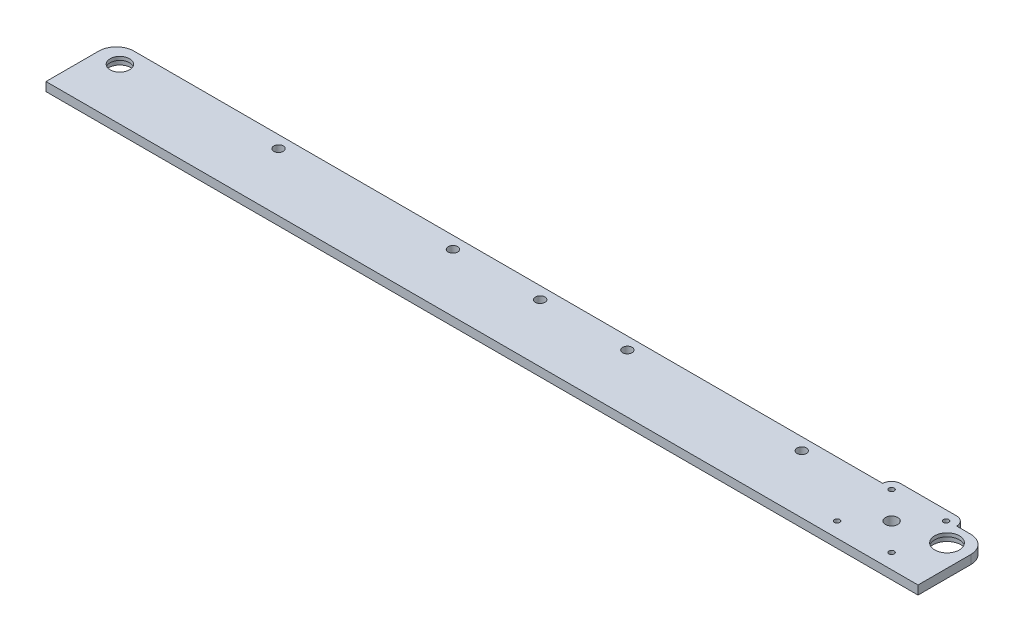
ISO-10303-21;
HEADER;
FILE_DESCRIPTION(('STEP AP214'),'2;1');
FILE_NAME('part.step','',(''),(''),'','','');
FILE_SCHEMA(('AUTOMOTIVE_DESIGN { 1 0 10303 214 1 1 1 1 }'));
ENDSEC;
DATA;
#1=APPLICATION_CONTEXT('core data for automotive mechanical design processes');
#2=APPLICATION_PROTOCOL_DEFINITION('international standard','automotive_design',2000,#1);
#3=PRODUCT_CONTEXT('',#1,'mechanical');
#4=PRODUCT('Part','Part','',(#3));
#5=PRODUCT_RELATED_PRODUCT_CATEGORY('part','',(#4));
#6=PRODUCT_DEFINITION_FORMATION('','',#4);
#7=PRODUCT_DEFINITION_CONTEXT('part definition',#1,'design');
#8=PRODUCT_DEFINITION('design','',#6,#7);
#9=PRODUCT_DEFINITION_SHAPE('','',#8);
#10=(LENGTH_UNIT() NAMED_UNIT(*) SI_UNIT(.MILLI.,.METRE.));
#11=(NAMED_UNIT(*) PLANE_ANGLE_UNIT() SI_UNIT($,.RADIAN.));
#12=(NAMED_UNIT(*) SI_UNIT($,.STERADIAN.) SOLID_ANGLE_UNIT());
#13=UNCERTAINTY_MEASURE_WITH_UNIT(LENGTH_MEASURE(1.E-05),#10,'distance_accuracy_value','');
#14=(GEOMETRIC_REPRESENTATION_CONTEXT(3) GLOBAL_UNCERTAINTY_ASSIGNED_CONTEXT((#13)) GLOBAL_UNIT_ASSIGNED_CONTEXT((#10,
#11,#12)) REPRESENTATION_CONTEXT('',''));
#15=CARTESIAN_POINT('',(0.,0.,0.));
#16=DIRECTION('',(0.,0.,1.));
#17=DIRECTION('',(1.,0.,0.));
#18=AXIS2_PLACEMENT_3D('',#15,#16,#17);
#19=CARTESIAN_POINT('',(49.1679753727923,0.,-63.278006446656));
#20=DIRECTION('',(0.,1.,0.));
#21=DIRECTION('',(0.,0.,1.));
#22=AXIS2_PLACEMENT_3D('',#19,#20,#21);
#23=CYLINDRICAL_SURFACE('',#22,1.5);
#24=CARTESIAN_POINT('',(49.1679753727923,5.,-63.278006446656));
#25=DIRECTION('',(0.,1.,0.));
#26=DIRECTION('',(0.,0.,1.));
#27=AXIS2_PLACEMENT_3D('',#24,#25,#26);
#28=CIRCLE('',#27,1.5);
#29=CARTESIAN_POINT('',(49.1679753727923,5.,-61.778006446656));
#30=VERTEX_POINT('',#29);
#31=EDGE_CURVE('E227',#30,#30,#28,.T.);
#32=ORIENTED_EDGE('',*,*,#31,.T.);
#33=EDGE_LOOP('',(#32));
#34=FACE_BOUND('',#33,.T.);
#35=CARTESIAN_POINT('',(49.1679753727923,2.,-63.278006446656));
#36=DIRECTION('',(0.,-1.,0.));
#37=DIRECTION('',(0.,0.,-1.));
#38=AXIS2_PLACEMENT_3D('',#35,#36,#37);
#39=CIRCLE('',#38,1.5);
#40=CARTESIAN_POINT('',(49.1679753727923,2.,-64.778006446656));
#41=VERTEX_POINT('',#40);
#42=EDGE_CURVE('E41',#41,#41,#39,.F.);
#43=ORIENTED_EDGE('',*,*,#42,.F.);
#44=EDGE_LOOP('',(#43));
#45=FACE_BOUND('',#44,.T.);
#46=ADVANCED_FACE('F37',(#34,#45),#23,.F.);
#47=CARTESIAN_POINT('',(80.1679753727923,0.,-63.278006446656));
#48=DIRECTION('',(0.,1.,0.));
#49=DIRECTION('',(0.,0.,1.));
#50=AXIS2_PLACEMENT_3D('',#47,#48,#49);
#51=CYLINDRICAL_SURFACE('',#50,1.5);
#52=CARTESIAN_POINT('',(80.1679753727923,5.,-63.278006446656));
#53=DIRECTION('',(0.,1.,0.));
#54=DIRECTION('',(0.,0.,1.));
#55=AXIS2_PLACEMENT_3D('',#52,#53,#54);
#56=CIRCLE('',#55,1.5);
#57=CARTESIAN_POINT('',(80.1679753727923,5.,-61.778006446656));
#58=VERTEX_POINT('',#57);
#59=EDGE_CURVE('E216',#58,#58,#56,.T.);
#60=ORIENTED_EDGE('',*,*,#59,.T.);
#61=EDGE_LOOP('',(#60));
#62=FACE_BOUND('',#61,.T.);
#63=CARTESIAN_POINT('',(80.1679753727923,2.,-63.278006446656));
#64=DIRECTION('',(0.,-1.,0.));
#65=DIRECTION('',(0.,0.,-1.));
#66=AXIS2_PLACEMENT_3D('',#63,#64,#65);
#67=CIRCLE('',#66,1.5);
#68=CARTESIAN_POINT('',(80.1679753727923,2.,-64.778006446656));
#69=VERTEX_POINT('',#68);
#70=EDGE_CURVE('E202',#69,#69,#67,.F.);
#71=ORIENTED_EDGE('',*,*,#70,.F.);
#72=EDGE_LOOP('',(#71));
#73=FACE_BOUND('',#72,.T.);
#74=ADVANCED_FACE('F319',(#62,#73),#51,.F.);
#75=CARTESIAN_POINT('',(80.1679753727923,0.,-32.278006446656));
#76=DIRECTION('',(0.,1.,0.));
#77=DIRECTION('',(0.,0.,1.));
#78=AXIS2_PLACEMENT_3D('',#75,#76,#77);
#79=CYLINDRICAL_SURFACE('',#78,1.5);
#80=CARTESIAN_POINT('',(80.1679753727923,5.,-32.278006446656));
#81=DIRECTION('',(0.,1.,0.));
#82=DIRECTION('',(0.,0.,1.));
#83=AXIS2_PLACEMENT_3D('',#80,#81,#82);
#84=CIRCLE('',#83,1.5);
#85=CARTESIAN_POINT('',(80.1679753727923,5.,-30.778006446656));
#86=VERTEX_POINT('',#85);
#87=EDGE_CURVE('E211',#86,#86,#84,.T.);
#88=ORIENTED_EDGE('',*,*,#87,.T.);
#89=EDGE_LOOP('',(#88));
#90=FACE_BOUND('',#89,.T.);
#91=CARTESIAN_POINT('',(80.1679753727923,2.,-32.278006446656));
#92=DIRECTION('',(0.,-1.,0.));
#93=DIRECTION('',(0.,0.,-1.));
#94=AXIS2_PLACEMENT_3D('',#91,#92,#93);
#95=CIRCLE('',#94,1.5);
#96=CARTESIAN_POINT('',(80.1679753727923,2.,-33.778006446656));
#97=VERTEX_POINT('',#96);
#98=EDGE_CURVE('E199',#97,#97,#95,.F.);
#99=ORIENTED_EDGE('',*,*,#98,.F.);
#100=EDGE_LOOP('',(#99));
#101=FACE_BOUND('',#100,.T.);
#102=ADVANCED_FACE('F325',(#90,#101),#79,.F.);
#103=CARTESIAN_POINT('',(49.1679753727923,0.,-32.278006446656));
#104=DIRECTION('',(0.,1.,0.));
#105=DIRECTION('',(0.,0.,1.));
#106=AXIS2_PLACEMENT_3D('',#103,#104,#105);
#107=CYLINDRICAL_SURFACE('',#106,1.5);
#108=CARTESIAN_POINT('',(49.1679753727923,5.,-32.278006446656));
#109=DIRECTION('',(0.,1.,0.));
#110=DIRECTION('',(0.,0.,1.));
#111=AXIS2_PLACEMENT_3D('',#108,#109,#110);
#112=CIRCLE('',#111,1.5);
#113=CARTESIAN_POINT('',(49.1679753727923,5.,-30.778006446656));
#114=VERTEX_POINT('',#113);
#115=EDGE_CURVE('E207',#114,#114,#112,.T.);
#116=ORIENTED_EDGE('',*,*,#115,.T.);
#117=EDGE_LOOP('',(#116));
#118=FACE_BOUND('',#117,.T.);
#119=CARTESIAN_POINT('',(49.1679753727923,2.,-32.278006446656));
#120=DIRECTION('',(0.,-1.,0.));
#121=DIRECTION('',(0.,0.,-1.));
#122=AXIS2_PLACEMENT_3D('',#119,#120,#121);
#123=CIRCLE('',#122,1.5);
#124=CARTESIAN_POINT('',(49.1679753727923,2.,-33.778006446656));
#125=VERTEX_POINT('',#124);
#126=EDGE_CURVE('E196',#125,#125,#123,.F.);
#127=ORIENTED_EDGE('',*,*,#126,.F.);
#128=EDGE_LOOP('',(#127));
#129=FACE_BOUND('',#128,.T.);
#130=ADVANCED_FACE('F336',(#118,#129),#107,.F.);
#131=CARTESIAN_POINT('',(-392.299026304365,5.,-63.778006446656));
#132=DIRECTION('',(0.,0.,1.));
#133=DIRECTION('',(1.,0.,0.));
#134=AXIS2_PLACEMENT_3D('',#131,#132,#133);
#135=PLANE('',#134);
#136=DIRECTION('',(-1.,0.,0.));
#137=VECTOR('',#136,1.);
#138=CARTESIAN_POINT('',(-392.299026304365,5.,-63.778006446656));
#139=LINE('',#138,#137);
#140=CARTESIAN_POINT('',(43.6679753727923,5.,-63.778006446656));
#141=VERTEX_POINT('',#140);
#142=CARTESIAN_POINT('',(-382.299026304365,5.,-63.778006446656));
#143=VERTEX_POINT('',#142);
#144=EDGE_CURVE('E143',#141,#143,#139,.T.);
#145=ORIENTED_EDGE('',*,*,#144,.F.);
#146=DIRECTION('',(0.,-1.,0.));
#147=VECTOR('',#146,1.);
#148=CARTESIAN_POINT('',(43.6679753727923,5.,-63.778006446656));
#149=LINE('',#148,#147);
#150=CARTESIAN_POINT('',(43.6679753727923,0.,-63.778006446656));
#151=VERTEX_POINT('',#150);
#152=EDGE_CURVE('E134',#141,#151,#149,.T.);
#153=ORIENTED_EDGE('',*,*,#152,.T.);
#154=DIRECTION('',(-1.,0.,0.));
#155=VECTOR('',#154,1.);
#156=CARTESIAN_POINT('',(-392.299026304365,0.,-63.778006446656));
#157=LINE('',#156,#155);
#158=CARTESIAN_POINT('',(-382.299026304365,0.,-63.778006446656));
#159=VERTEX_POINT('',#158);
#160=EDGE_CURVE('E160',#151,#159,#157,.T.);
#161=ORIENTED_EDGE('',*,*,#160,.T.);
#162=DIRECTION('',(0.,-1.,0.));
#163=VECTOR('',#162,1.);
#164=CARTESIAN_POINT('',(-382.299026304365,5.,-63.778006446656));
#165=LINE('',#164,#163);
#166=EDGE_CURVE('E183',#159,#143,#165,.F.);
#167=ORIENTED_EDGE('',*,*,#166,.T.);
#168=EDGE_LOOP('',(#145,#153,#161,#167));
#169=FACE_BOUND('',#168,.T.);
#170=ADVANCED_FACE('F294',(#169),#135,.F.);
#171=CARTESIAN_POINT('',(-379.799026304365,5.,-53.278006446656));
#172=DIRECTION('',(0.,-1.,0.));
#173=DIRECTION('',(0.,0.,-1.));
#174=AXIS2_PLACEMENT_3D('',#171,#172,#173);
#175=CYLINDRICAL_SURFACE('',#174,5.50000000000002);
#176=CARTESIAN_POINT('',(-379.799026304365,5.,-53.278006446656));
#177=DIRECTION('',(0.,1.,0.));
#178=DIRECTION('',(0.,0.,1.));
#179=AXIS2_PLACEMENT_3D('',#176,#177,#178);
#180=CIRCLE('',#179,5.50000000000002);
#181=CARTESIAN_POINT('',(-379.799026304365,5.,-47.778006446656));
#182=VERTEX_POINT('',#181);
#183=EDGE_CURVE('E268',#182,#182,#180,.T.);
#184=ORIENTED_EDGE('',*,*,#183,.T.);
#185=EDGE_LOOP('',(#184));
#186=FACE_BOUND('',#185,.T.);
#187=CARTESIAN_POINT('',(-379.799026304365,3.,-53.278006446656));
#188=DIRECTION('',(0.,-1.,0.));
#189=DIRECTION('',(0.,0.,-1.));
#190=AXIS2_PLACEMENT_3D('',#187,#188,#189);
#191=CIRCLE('',#190,5.50000000000002);
#192=CARTESIAN_POINT('',(-379.799026304365,3.,-58.778006446656));
#193=VERTEX_POINT('',#192);
#194=EDGE_CURVE('E169',#193,#193,#191,.T.);
#195=ORIENTED_EDGE('',*,*,#194,.T.);
#196=EDGE_LOOP('',(#195));
#197=FACE_BOUND('',#196,.T.);
#198=ADVANCED_FACE('F381',(#186,#197),#175,.F.);
#199=CARTESIAN_POINT('',(91.2009736956355,5.,-52.778006446656));
#200=DIRECTION('',(0.,-1.,0.));
#201=DIRECTION('',(0.,0.,-1.));
#202=AXIS2_PLACEMENT_3D('',#199,#200,#201);
#203=CYLINDRICAL_SURFACE('',#202,7.);
#204=CARTESIAN_POINT('',(91.2009736956355,5.,-52.778006446656));
#205=DIRECTION('',(0.,1.,0.));
#206=DIRECTION('',(0.,0.,1.));
#207=AXIS2_PLACEMENT_3D('',#204,#205,#206);
#208=CIRCLE('',#207,7.);
#209=CARTESIAN_POINT('',(91.2009736956355,5.,-45.778006446656));
#210=VERTEX_POINT('',#209);
#211=EDGE_CURVE('E263',#210,#210,#208,.T.);
#212=ORIENTED_EDGE('',*,*,#211,.T.);
#213=EDGE_LOOP('',(#212));
#214=FACE_BOUND('',#213,.T.);
#215=CARTESIAN_POINT('',(91.2009736956355,3.,-52.778006446656));
#216=DIRECTION('',(0.,-1.,0.));
#217=DIRECTION('',(0.,0.,-1.));
#218=AXIS2_PLACEMENT_3D('',#215,#216,#217);
#219=CIRCLE('',#218,7.);
#220=CARTESIAN_POINT('',(91.2009736956355,3.,-59.778006446656));
#221=VERTEX_POINT('',#220);
#222=EDGE_CURVE('E166',#221,#221,#219,.T.);
#223=ORIENTED_EDGE('',*,*,#222,.T.);
#224=EDGE_LOOP('',(#223));
#225=FACE_BOUND('',#224,.T.);
#226=ADVANCED_FACE('F378',(#214,#225),#203,.F.);
#227=CARTESIAN_POINT('',(0.,5.,0.));
#228=DIRECTION('',(0.,1.,0.));
#229=DIRECTION('',(0.,0.,1.));
#230=AXIS2_PLACEMENT_3D('',#227,#228,#229);
#231=PLANE('',#230);
#232=ORIENTED_EDGE('',*,*,#115,.F.);
#233=EDGE_LOOP('',(#232));
#234=FACE_BOUND('',#233,.T.);
#235=ORIENTED_EDGE('',*,*,#87,.F.);
#236=EDGE_LOOP('',(#235));
#237=FACE_BOUND('',#236,.T.);
#238=ORIENTED_EDGE('',*,*,#59,.F.);
#239=EDGE_LOOP('',(#238));
#240=FACE_BOUND('',#239,.T.);
#241=ORIENTED_EDGE('',*,*,#31,.F.);
#242=EDGE_LOOP('',(#241));
#243=FACE_BOUND('',#242,.T.);
#244=CARTESIAN_POINT('',(64.6679753727923,5.,-47.778006446656));
#245=DIRECTION('',(0.,1.,0.));
#246=DIRECTION('',(0.,0.,1.));
#247=AXIS2_PLACEMENT_3D('',#244,#245,#246);
#248=CIRCLE('',#247,3.50000000000001);
#249=CARTESIAN_POINT('',(64.6679753727923,5.,-44.278006446656));
#250=VERTEX_POINT('',#249);
#251=EDGE_CURVE('E224',#250,#250,#248,.T.);
#252=ORIENTED_EDGE('',*,*,#251,.F.);
#253=EDGE_LOOP('',(#252));
#254=FACE_BOUND('',#253,.T.);
#255=DIRECTION('',(-1.,0.,0.));
#256=VECTOR('',#255,1.);
#257=CARTESIAN_POINT('',(43.6679753727923,5.,-68.778006446656));
#258=LINE('',#257,#256);
#259=CARTESIAN_POINT('',(80.6679753727923,5.,-68.778006446656));
#260=VERTEX_POINT('',#259);
#261=CARTESIAN_POINT('',(48.6679753727923,5.,-68.778006446656));
#262=VERTEX_POINT('',#261);
#263=EDGE_CURVE('E223',#260,#262,#258,.T.);
#264=ORIENTED_EDGE('',*,*,#263,.T.);
#265=CARTESIAN_POINT('',(48.6679753727923,5.,-63.778006446656));
#266=DIRECTION('',(0.,1.,0.));
#267=DIRECTION('',(0.,0.,1.));
#268=AXIS2_PLACEMENT_3D('',#265,#266,#267);
#269=CIRCLE('',#268,5.);
#270=EDGE_CURVE('E122',#262,#141,#269,.T.);
#271=ORIENTED_EDGE('',*,*,#270,.T.);
#272=ORIENTED_EDGE('',*,*,#144,.T.);
#273=CARTESIAN_POINT('',(-382.299026304365,5.,-53.778006446656));
#274=DIRECTION('',(0.,1.,0.));
#275=DIRECTION('',(0.,0.,1.));
#276=AXIS2_PLACEMENT_3D('',#273,#274,#275);
#277=CIRCLE('',#276,10.);
#278=CARTESIAN_POINT('',(-392.299026304365,5.,-53.778006446656));
#279=VERTEX_POINT('',#278);
#280=EDGE_CURVE('E187',#143,#279,#277,.T.);
#281=ORIENTED_EDGE('',*,*,#280,.T.);
#282=DIRECTION('',(0.,0.,1.));
#283=VECTOR('',#282,1.);
#284=CARTESIAN_POINT('',(-392.299026304365,5.,-63.778006446656));
#285=LINE('',#284,#283);
#286=CARTESIAN_POINT('',(-392.299026304365,5.,-23.778006446656));
#287=VERTEX_POINT('',#286);
#288=EDGE_CURVE('E161',#279,#287,#285,.T.);
#289=ORIENTED_EDGE('',*,*,#288,.T.);
#290=DIRECTION('',(1.,0.,0.));
#291=VECTOR('',#290,1.);
#292=CARTESIAN_POINT('',(-392.299026304365,5.,-23.778006446656));
#293=LINE('',#292,#291);
#294=CARTESIAN_POINT('',(103.700973695635,5.,-23.778006446656));
#295=VERTEX_POINT('',#294);
#296=EDGE_CURVE('E276',#287,#295,#293,.T.);
#297=ORIENTED_EDGE('',*,*,#296,.T.);
#298=DIRECTION('',(0.,0.,-1.));
#299=VECTOR('',#298,1.);
#300=CARTESIAN_POINT('',(103.700973695635,5.,-63.778006446656));
#301=LINE('',#300,#299);
#302=CARTESIAN_POINT('',(103.700973695635,5.,-53.778006446656));
#303=VERTEX_POINT('',#302);
#304=EDGE_CURVE('E148',#295,#303,#301,.T.);
#305=ORIENTED_EDGE('',*,*,#304,.T.);
#306=CARTESIAN_POINT('',(93.7009736956355,5.,-53.778006446656));
#307=DIRECTION('',(0.,1.,0.));
#308=DIRECTION('',(0.,0.,1.));
#309=AXIS2_PLACEMENT_3D('',#306,#307,#308);
#310=CIRCLE('',#309,10.);
#311=CARTESIAN_POINT('',(93.7009736956355,5.,-63.778006446656));
#312=VERTEX_POINT('',#311);
#313=EDGE_CURVE('E141',#303,#312,#310,.T.);
#314=ORIENTED_EDGE('',*,*,#313,.T.);
#315=CARTESIAN_POINT('',(85.6679753727923,5.,-63.778006446656));
#316=VERTEX_POINT('',#315);
#317=EDGE_CURVE('E130',#312,#316,#139,.T.);
#318=ORIENTED_EDGE('',*,*,#317,.T.);
#319=CARTESIAN_POINT('',(80.6679753727923,5.,-63.778006446656));
#320=DIRECTION('',(0.,1.,0.));
#321=DIRECTION('',(0.,0.,1.));
#322=AXIS2_PLACEMENT_3D('',#319,#320,#321);
#323=CIRCLE('',#322,5.);
#324=EDGE_CURVE('E115',#316,#260,#323,.T.);
#325=ORIENTED_EDGE('',*,*,#324,.T.);
#326=EDGE_LOOP('',(#264,#271,#272,#281,#289,#297,#305,#314,#318,#325));
#327=FACE_BOUND('',#326,.T.);
#328=CARTESIAN_POINT('',(-144.299026304365,5.,-56.8446731133226));
#329=DIRECTION('',(0.,1.,0.));
#330=DIRECTION('',(0.,0.,1.));
#331=AXIS2_PLACEMENT_3D('',#328,#329,#330);
#332=CIRCLE('',#331,2.70000000000001);
#333=CARTESIAN_POINT('',(-144.299026304365,5.,-54.1446731133226));
#334=VERTEX_POINT('',#333);
#335=EDGE_CURVE('E248',#334,#334,#332,.T.);
#336=ORIENTED_EDGE('',*,*,#335,.F.);
#337=EDGE_LOOP('',(#336));
#338=FACE_BOUND('',#337,.T.);
#339=CARTESIAN_POINT('',(-94.6990263043645,5.,-56.8446731133226));
#340=DIRECTION('',(0.,1.,0.));
#341=DIRECTION('',(0.,0.,1.));
#342=AXIS2_PLACEMENT_3D('',#339,#340,#341);
#343=CIRCLE('',#342,2.7);
#344=CARTESIAN_POINT('',(-94.6990263043645,5.,-54.1446731133226));
#345=VERTEX_POINT('',#344);
#346=EDGE_CURVE('E260',#345,#345,#343,.T.);
#347=ORIENTED_EDGE('',*,*,#346,.F.);
#348=EDGE_LOOP('',(#347));
#349=FACE_BOUND('',#348,.T.);
#350=ORIENTED_EDGE('',*,*,#183,.F.);
#351=EDGE_LOOP('',(#350));
#352=FACE_BOUND('',#351,.T.);
#353=CARTESIAN_POINT('',(-193.899026304365,5.,-56.8446731133226));
#354=DIRECTION('',(0.,1.,0.));
#355=DIRECTION('',(0.,0.,1.));
#356=AXIS2_PLACEMENT_3D('',#353,#354,#355);
#357=CIRCLE('',#356,2.70000000000001);
#358=CARTESIAN_POINT('',(-193.899026304365,5.,-54.1446731133226));
#359=VERTEX_POINT('',#358);
#360=EDGE_CURVE('E155',#359,#359,#357,.T.);
#361=ORIENTED_EDGE('',*,*,#360,.F.);
#362=EDGE_LOOP('',(#361));
#363=FACE_BOUND('',#362,.T.);
#364=ORIENTED_EDGE('',*,*,#211,.F.);
#365=EDGE_LOOP('',(#364));
#366=FACE_BOUND('',#365,.T.);
#367=CARTESIAN_POINT('',(4.50097369563546,5.,-56.8446731133226));
#368=DIRECTION('',(0.,1.,0.));
#369=DIRECTION('',(0.,0.,1.));
#370=AXIS2_PLACEMENT_3D('',#367,#368,#369);
#371=CIRCLE('',#370,2.7);
#372=CARTESIAN_POINT('',(4.50097369563546,5.,-54.1446731133226));
#373=VERTEX_POINT('',#372);
#374=EDGE_CURVE('E254',#373,#373,#371,.T.);
#375=ORIENTED_EDGE('',*,*,#374,.F.);
#376=EDGE_LOOP('',(#375));
#377=FACE_BOUND('',#376,.T.);
#378=CARTESIAN_POINT('',(-293.099026304365,5.,-56.8446731133226));
#379=DIRECTION('',(0.,1.,0.));
#380=DIRECTION('',(0.,0.,1.));
#381=AXIS2_PLACEMENT_3D('',#378,#379,#380);
#382=CIRCLE('',#381,2.69999999999996);
#383=CARTESIAN_POINT('',(-293.099026304365,5.,-54.1446731133227));
#384=VERTEX_POINT('',#383);
#385=EDGE_CURVE('E242',#384,#384,#382,.T.);
#386=ORIENTED_EDGE('',*,*,#385,.F.);
#387=EDGE_LOOP('',(#386));
#388=FACE_BOUND('',#387,.T.);
#389=ADVANCED_FACE('F137',(#234,#237,#240,#243,#254,#327,#338,#349,#352,#363,#366,#377,#388),
#231,.T.);
#390=CARTESIAN_POINT('',(0.,0.,0.));
#391=DIRECTION('',(0.,1.,0.));
#392=DIRECTION('',(0.,0.,1.));
#393=AXIS2_PLACEMENT_3D('',#390,#391,#392);
#394=PLANE('',#393);
#395=CARTESIAN_POINT('',(80.1679753727923,0.,-32.278006446656));
#396=DIRECTION('',(0.,-1.,0.));
#397=DIRECTION('',(0.,0.,-1.));
#398=AXIS2_PLACEMENT_3D('',#395,#396,#397);
#399=CIRCLE('',#398,3.00000000000001);
#400=CARTESIAN_POINT('',(80.1679753727923,0.,-35.278006446656));
#401=VERTEX_POINT('',#400);
#402=EDGE_CURVE('E401',#401,#401,#399,.T.);
#403=ORIENTED_EDGE('',*,*,#402,.F.);
#404=EDGE_LOOP('',(#403));
#405=FACE_BOUND('',#404,.T.);
#406=CARTESIAN_POINT('',(49.1679753727923,0.,-63.278006446656));
#407=DIRECTION('',(0.,-1.,0.));
#408=DIRECTION('',(0.,0.,-1.));
#409=AXIS2_PLACEMENT_3D('',#406,#407,#408);
#410=CIRCLE('',#409,3.);
#411=CARTESIAN_POINT('',(49.1679753727923,0.,-66.278006446656));
#412=VERTEX_POINT('',#411);
#413=EDGE_CURVE('E405',#412,#412,#410,.T.);
#414=ORIENTED_EDGE('',*,*,#413,.F.);
#415=EDGE_LOOP('',(#414));
#416=FACE_BOUND('',#415,.T.);
#417=CARTESIAN_POINT('',(80.1679753727923,0.,-63.278006446656));
#418=DIRECTION('',(0.,-1.,0.));
#419=DIRECTION('',(0.,0.,-1.));
#420=AXIS2_PLACEMENT_3D('',#417,#418,#419);
#421=CIRCLE('',#420,3.00000000000001);
#422=CARTESIAN_POINT('',(80.1679753727923,0.,-66.278006446656));
#423=VERTEX_POINT('',#422);
#424=EDGE_CURVE('E409',#423,#423,#421,.T.);
#425=ORIENTED_EDGE('',*,*,#424,.F.);
#426=EDGE_LOOP('',(#425));
#427=FACE_BOUND('',#426,.T.);
#428=CARTESIAN_POINT('',(49.1679753727923,0.,-32.278006446656));
#429=DIRECTION('',(0.,-1.,0.));
#430=DIRECTION('',(0.,0.,-1.));
#431=AXIS2_PLACEMENT_3D('',#428,#429,#430);
#432=CIRCLE('',#431,3.);
#433=CARTESIAN_POINT('',(49.1679753727923,0.,-35.278006446656));
#434=VERTEX_POINT('',#433);
#435=EDGE_CURVE('E413',#434,#434,#432,.T.);
#436=ORIENTED_EDGE('',*,*,#435,.F.);
#437=EDGE_LOOP('',(#436));
#438=FACE_BOUND('',#437,.T.);
#439=CARTESIAN_POINT('',(64.6679753727923,0.,-47.778006446656));
#440=DIRECTION('',(0.,1.,0.));
#441=DIRECTION('',(0.,0.,1.));
#442=AXIS2_PLACEMENT_3D('',#439,#440,#441);
#443=CIRCLE('',#442,3.50000000000001);
#444=CARTESIAN_POINT('',(64.6679753727923,0.,-44.278006446656));
#445=VERTEX_POINT('',#444);
#446=EDGE_CURVE('E220',#445,#445,#443,.T.);
#447=ORIENTED_EDGE('',*,*,#446,.T.);
#448=EDGE_LOOP('',(#447));
#449=FACE_BOUND('',#448,.T.);
#450=ORIENTED_EDGE('',*,*,#160,.F.);
#451=CARTESIAN_POINT('',(48.6679753727923,0.,-63.778006446656));
#452=DIRECTION('',(0.,1.,0.));
#453=DIRECTION('',(0.,0.,1.));
#454=AXIS2_PLACEMENT_3D('',#451,#452,#453);
#455=CIRCLE('',#454,5.);
#456=CARTESIAN_POINT('',(48.6679753727923,0.,-68.778006446656));
#457=VERTEX_POINT('',#456);
#458=EDGE_CURVE('E11',#151,#457,#455,.F.);
#459=ORIENTED_EDGE('',*,*,#458,.T.);
#460=DIRECTION('',(-1.,0.,0.));
#461=VECTOR('',#460,1.);
#462=CARTESIAN_POINT('',(43.6679753727923,0.,-68.778006446656));
#463=LINE('',#462,#461);
#464=CARTESIAN_POINT('',(80.6679753727923,0.,-68.778006446656));
#465=VERTEX_POINT('',#464);
#466=EDGE_CURVE('E228',#465,#457,#463,.T.);
#467=ORIENTED_EDGE('',*,*,#466,.F.);
#468=CARTESIAN_POINT('',(80.6679753727923,0.,-63.778006446656));
#469=DIRECTION('',(0.,1.,0.));
#470=DIRECTION('',(0.,0.,1.));
#471=AXIS2_PLACEMENT_3D('',#468,#469,#470);
#472=CIRCLE('',#471,5.);
#473=CARTESIAN_POINT('',(85.6679753727923,0.,-63.778006446656));
#474=VERTEX_POINT('',#473);
#475=EDGE_CURVE('E46',#465,#474,#472,.F.);
#476=ORIENTED_EDGE('',*,*,#475,.T.);
#477=CARTESIAN_POINT('',(93.7009736956355,0.,-63.778006446656));
#478=VERTEX_POINT('',#477);
#479=EDGE_CURVE('E133',#478,#474,#157,.T.);
#480=ORIENTED_EDGE('',*,*,#479,.F.);
#481=CARTESIAN_POINT('',(93.7009736956355,0.,-53.778006446656));
#482=DIRECTION('',(0.,1.,0.));
#483=DIRECTION('',(0.,0.,1.));
#484=AXIS2_PLACEMENT_3D('',#481,#482,#483);
#485=CIRCLE('',#484,10.);
#486=CARTESIAN_POINT('',(103.700973695635,0.,-53.778006446656));
#487=VERTEX_POINT('',#486);
#488=EDGE_CURVE('E176',#478,#487,#485,.F.);
#489=ORIENTED_EDGE('',*,*,#488,.T.);
#490=DIRECTION('',(0.,0.,-1.));
#491=VECTOR('',#490,1.);
#492=CARTESIAN_POINT('',(103.700973695635,0.,-63.778006446656));
#493=LINE('',#492,#491);
#494=CARTESIAN_POINT('',(103.700973695635,0.,-23.778006446656));
#495=VERTEX_POINT('',#494);
#496=EDGE_CURVE('E157',#495,#487,#493,.T.);
#497=ORIENTED_EDGE('',*,*,#496,.F.);
#498=DIRECTION('',(1.,0.,0.));
#499=VECTOR('',#498,1.);
#500=CARTESIAN_POINT('',(-392.299026304365,0.,-23.778006446656));
#501=LINE('',#500,#499);
#502=CARTESIAN_POINT('',(-392.299026304365,0.,-23.778006446656));
#503=VERTEX_POINT('',#502);
#504=EDGE_CURVE('E154',#503,#495,#501,.T.);
#505=ORIENTED_EDGE('',*,*,#504,.F.);
#506=DIRECTION('',(0.,0.,1.));
#507=VECTOR('',#506,1.);
#508=CARTESIAN_POINT('',(-392.299026304365,0.,-63.778006446656));
#509=LINE('',#508,#507);
#510=CARTESIAN_POINT('',(-392.299026304365,0.,-53.778006446656));
#511=VERTEX_POINT('',#510);
#512=EDGE_CURVE('E152',#511,#503,#509,.T.);
#513=ORIENTED_EDGE('',*,*,#512,.F.);
#514=CARTESIAN_POINT('',(-382.299026304365,0.,-53.778006446656));
#515=DIRECTION('',(0.,1.,0.));
#516=DIRECTION('',(0.,0.,1.));
#517=AXIS2_PLACEMENT_3D('',#514,#515,#516);
#518=CIRCLE('',#517,10.);
#519=EDGE_CURVE('E178',#511,#159,#518,.F.);
#520=ORIENTED_EDGE('',*,*,#519,.T.);
#521=EDGE_LOOP('',(#450,#459,#467,#476,#480,#489,#497,#505,#513,#520));
#522=FACE_BOUND('',#521,.T.);
#523=CARTESIAN_POINT('',(-379.799026304365,0.,-53.278006446656));
#524=DIRECTION('',(0.,-1.,0.));
#525=DIRECTION('',(0.,0.,-1.));
#526=AXIS2_PLACEMENT_3D('',#523,#524,#525);
#527=CIRCLE('',#526,6.50000000000001);
#528=CARTESIAN_POINT('',(-379.799026304365,0.,-59.778006446656));
#529=VERTEX_POINT('',#528);
#530=EDGE_CURVE('E234',#529,#529,#527,.T.);
#531=ORIENTED_EDGE('',*,*,#530,.F.);
#532=EDGE_LOOP('',(#531));
#533=FACE_BOUND('',#532,.T.);
#534=CARTESIAN_POINT('',(91.2009736956355,0.,-52.778006446656));
#535=DIRECTION('',(0.,-1.,0.));
#536=DIRECTION('',(0.,0.,-1.));
#537=AXIS2_PLACEMENT_3D('',#534,#535,#536);
#538=CIRCLE('',#537,8.00000000000001);
#539=CARTESIAN_POINT('',(91.2009736956355,0.,-60.778006446656));
#540=VERTEX_POINT('',#539);
#541=EDGE_CURVE('E237',#540,#540,#538,.T.);
#542=ORIENTED_EDGE('',*,*,#541,.F.);
#543=EDGE_LOOP('',(#542));
#544=FACE_BOUND('',#543,.T.);
#545=CARTESIAN_POINT('',(-193.899026304365,0.,-56.8446731133226));
#546=DIRECTION('',(0.,1.,0.));
#547=DIRECTION('',(0.,0.,1.));
#548=AXIS2_PLACEMENT_3D('',#545,#546,#547);
#549=CIRCLE('',#548,2.70000000000001);
#550=CARTESIAN_POINT('',(-193.899026304365,0.,-54.1446731133226));
#551=VERTEX_POINT('',#550);
#552=EDGE_CURVE('E271',#551,#551,#549,.T.);
#553=ORIENTED_EDGE('',*,*,#552,.T.);
#554=EDGE_LOOP('',(#553));
#555=FACE_BOUND('',#554,.T.);
#556=CARTESIAN_POINT('',(-94.6990263043645,0.,-56.8446731133226));
#557=DIRECTION('',(0.,1.,0.));
#558=DIRECTION('',(0.,0.,1.));
#559=AXIS2_PLACEMENT_3D('',#556,#557,#558);
#560=CIRCLE('',#559,2.7);
#561=CARTESIAN_POINT('',(-94.6990263043645,0.,-54.1446731133226));
#562=VERTEX_POINT('',#561);
#563=EDGE_CURVE('E257',#562,#562,#560,.T.);
#564=ORIENTED_EDGE('',*,*,#563,.T.);
#565=EDGE_LOOP('',(#564));
#566=FACE_BOUND('',#565,.T.);
#567=CARTESIAN_POINT('',(4.50097369563546,0.,-56.8446731133226));
#568=DIRECTION('',(0.,1.,0.));
#569=DIRECTION('',(0.,0.,1.));
#570=AXIS2_PLACEMENT_3D('',#567,#568,#569);
#571=CIRCLE('',#570,2.7);
#572=CARTESIAN_POINT('',(4.50097369563546,0.,-54.1446731133226));
#573=VERTEX_POINT('',#572);
#574=EDGE_CURVE('E251',#573,#573,#571,.T.);
#575=ORIENTED_EDGE('',*,*,#574,.T.);
#576=EDGE_LOOP('',(#575));
#577=FACE_BOUND('',#576,.T.);
#578=CARTESIAN_POINT('',(-144.299026304365,0.,-56.8446731133226));
#579=DIRECTION('',(0.,1.,0.));
#580=DIRECTION('',(0.,0.,1.));
#581=AXIS2_PLACEMENT_3D('',#578,#579,#580);
#582=CIRCLE('',#581,2.70000000000001);
#583=CARTESIAN_POINT('',(-144.299026304365,0.,-54.1446731133226));
#584=VERTEX_POINT('',#583);
#585=EDGE_CURVE('E245',#584,#584,#582,.T.);
#586=ORIENTED_EDGE('',*,*,#585,.T.);
#587=EDGE_LOOP('',(#586));
#588=FACE_BOUND('',#587,.T.);
#589=CARTESIAN_POINT('',(-293.099026304365,0.,-56.8446731133226));
#590=DIRECTION('',(0.,1.,0.));
#591=DIRECTION('',(0.,0.,1.));
#592=AXIS2_PLACEMENT_3D('',#589,#590,#591);
#593=CIRCLE('',#592,2.69999999999996);
#594=CARTESIAN_POINT('',(-293.099026304365,0.,-54.1446731133227));
#595=VERTEX_POINT('',#594);
#596=EDGE_CURVE('E173',#595,#595,#593,.T.);
#597=ORIENTED_EDGE('',*,*,#596,.T.);
#598=EDGE_LOOP('',(#597));
#599=FACE_BOUND('',#598,.T.);
#600=ADVANCED_FACE('F284',(#405,#416,#427,#438,#449,#522,#533,#544,#555,#566,#577,#588,#599),
#394,.F.);
#601=CARTESIAN_POINT('',(-392.299026304365,5.,-63.778006446656));
#602=DIRECTION('',(1.,0.,0.));
#603=DIRECTION('',(0.,0.,-1.));
#604=AXIS2_PLACEMENT_3D('',#601,#602,#603);
#605=PLANE('',#604);
#606=ORIENTED_EDGE('',*,*,#288,.F.);
#607=DIRECTION('',(0.,-1.,0.));
#608=VECTOR('',#607,1.);
#609=CARTESIAN_POINT('',(-392.299026304365,5.,-53.778006446656));
#610=LINE('',#609,#608);
#611=EDGE_CURVE('E165',#279,#511,#610,.T.);
#612=ORIENTED_EDGE('',*,*,#611,.T.);
#613=ORIENTED_EDGE('',*,*,#512,.T.);
#614=DIRECTION('',(0.,-1.,0.));
#615=VECTOR('',#614,1.);
#616=CARTESIAN_POINT('',(-392.299026304365,5.,-23.778006446656));
#617=LINE('',#616,#615);
#618=EDGE_CURVE('E146',#287,#503,#617,.T.);
#619=ORIENTED_EDGE('',*,*,#618,.F.);
#620=EDGE_LOOP('',(#606,#612,#613,#619));
#621=FACE_BOUND('',#620,.T.);
#622=ADVANCED_FACE('F303',(#621),#605,.F.);
#623=CARTESIAN_POINT('',(-392.299026304365,5.,-23.778006446656));
#624=DIRECTION('',(0.,0.,-1.));
#625=DIRECTION('',(-1.,0.,0.));
#626=AXIS2_PLACEMENT_3D('',#623,#624,#625);
#627=PLANE('',#626);
#628=ORIENTED_EDGE('',*,*,#504,.T.);
#629=DIRECTION('',(0.,-1.,0.));
#630=VECTOR('',#629,1.);
#631=CARTESIAN_POINT('',(103.700973695635,5.,-23.778006446656));
#632=LINE('',#631,#630);
#633=EDGE_CURVE('E142',#295,#495,#632,.T.);
#634=ORIENTED_EDGE('',*,*,#633,.F.);
#635=ORIENTED_EDGE('',*,*,#296,.F.);
#636=ORIENTED_EDGE('',*,*,#618,.T.);
#637=EDGE_LOOP('',(#628,#634,#635,#636));
#638=FACE_BOUND('',#637,.T.);
#639=ADVANCED_FACE('F307',(#638),#627,.F.);
#640=CARTESIAN_POINT('',(103.700973695635,5.,-63.778006446656));
#641=DIRECTION('',(-1.,0.,0.));
#642=DIRECTION('',(0.,0.,1.));
#643=AXIS2_PLACEMENT_3D('',#640,#641,#642);
#644=PLANE('',#643);
#645=ORIENTED_EDGE('',*,*,#496,.T.);
#646=DIRECTION('',(0.,-1.,0.));
#647=VECTOR('',#646,1.);
#648=CARTESIAN_POINT('',(103.700973695635,5.,-53.778006446656));
#649=LINE('',#648,#647);
#650=EDGE_CURVE('E135',#487,#303,#649,.F.);
#651=ORIENTED_EDGE('',*,*,#650,.T.);
#652=ORIENTED_EDGE('',*,*,#304,.F.);
#653=ORIENTED_EDGE('',*,*,#633,.T.);
#654=EDGE_LOOP('',(#645,#651,#652,#653));
#655=FACE_BOUND('',#654,.T.);
#656=ADVANCED_FACE('F308',(#655),#644,.F.);
#657=ORIENTED_EDGE('',*,*,#479,.T.);
#658=DIRECTION('',(0.,1.,0.));
#659=VECTOR('',#658,1.);
#660=CARTESIAN_POINT('',(85.6679753727923,5.,-63.778006446656));
#661=LINE('',#660,#659);
#662=EDGE_CURVE('E118',#474,#316,#661,.T.);
#663=ORIENTED_EDGE('',*,*,#662,.T.);
#664=ORIENTED_EDGE('',*,*,#317,.F.);
#665=DIRECTION('',(0.,-1.,0.));
#666=VECTOR('',#665,1.);
#667=CARTESIAN_POINT('',(93.7009736956355,5.,-63.778006446656));
#668=LINE('',#667,#666);
#669=EDGE_CURVE('E181',#312,#478,#668,.T.);
#670=ORIENTED_EDGE('',*,*,#669,.T.);
#671=EDGE_LOOP('',(#657,#663,#664,#670));
#672=FACE_BOUND('',#671,.T.);
#673=ADVANCED_FACE('F128',(#672),#135,.F.);
#674=CARTESIAN_POINT('',(-193.899026304365,5.,-56.8446731133226));
#675=DIRECTION('',(0.,-1.,0.));
#676=DIRECTION('',(0.,0.,-1.));
#677=AXIS2_PLACEMENT_3D('',#674,#675,#676);
#678=CYLINDRICAL_SURFACE('',#677,2.70000000000001);
#679=ORIENTED_EDGE('',*,*,#360,.T.);
#680=EDGE_LOOP('',(#679));
#681=FACE_BOUND('',#680,.T.);
#682=ORIENTED_EDGE('',*,*,#552,.F.);
#683=EDGE_LOOP('',(#682));
#684=FACE_BOUND('',#683,.T.);
#685=ADVANCED_FACE('F315',(#681,#684),#678,.F.);
#686=CARTESIAN_POINT('',(-94.6990263043645,5.,-56.8446731133226));
#687=DIRECTION('',(0.,-1.,0.));
#688=DIRECTION('',(0.,0.,-1.));
#689=AXIS2_PLACEMENT_3D('',#686,#687,#688);
#690=CYLINDRICAL_SURFACE('',#689,2.7);
#691=ORIENTED_EDGE('',*,*,#346,.T.);
#692=EDGE_LOOP('',(#691));
#693=FACE_BOUND('',#692,.T.);
#694=ORIENTED_EDGE('',*,*,#563,.F.);
#695=EDGE_LOOP('',(#694));
#696=FACE_BOUND('',#695,.T.);
#697=ADVANCED_FACE('F373',(#693,#696),#690,.F.);
#698=CARTESIAN_POINT('',(4.50097369563546,5.,-56.8446731133226));
#699=DIRECTION('',(0.,-1.,0.));
#700=DIRECTION('',(0.,0.,-1.));
#701=AXIS2_PLACEMENT_3D('',#698,#699,#700);
#702=CYLINDRICAL_SURFACE('',#701,2.7);
#703=ORIENTED_EDGE('',*,*,#374,.T.);
#704=EDGE_LOOP('',(#703));
#705=FACE_BOUND('',#704,.T.);
#706=ORIENTED_EDGE('',*,*,#574,.F.);
#707=EDGE_LOOP('',(#706));
#708=FACE_BOUND('',#707,.T.);
#709=ADVANCED_FACE('F369',(#705,#708),#702,.F.);
#710=CARTESIAN_POINT('',(-144.299026304365,5.,-56.8446731133226));
#711=DIRECTION('',(0.,-1.,0.));
#712=DIRECTION('',(0.,0.,-1.));
#713=AXIS2_PLACEMENT_3D('',#710,#711,#712);
#714=CYLINDRICAL_SURFACE('',#713,2.70000000000001);
#715=ORIENTED_EDGE('',*,*,#335,.T.);
#716=EDGE_LOOP('',(#715));
#717=FACE_BOUND('',#716,.T.);
#718=ORIENTED_EDGE('',*,*,#585,.F.);
#719=EDGE_LOOP('',(#718));
#720=FACE_BOUND('',#719,.T.);
#721=ADVANCED_FACE('F365',(#717,#720),#714,.F.);
#722=CARTESIAN_POINT('',(-293.099026304365,5.,-56.8446731133226));
#723=DIRECTION('',(0.,-1.,0.));
#724=DIRECTION('',(0.,0.,-1.));
#725=AXIS2_PLACEMENT_3D('',#722,#723,#724);
#726=CYLINDRICAL_SURFACE('',#725,2.69999999999996);
#727=ORIENTED_EDGE('',*,*,#385,.T.);
#728=EDGE_LOOP('',(#727));
#729=FACE_BOUND('',#728,.T.);
#730=ORIENTED_EDGE('',*,*,#596,.F.);
#731=EDGE_LOOP('',(#730));
#732=FACE_BOUND('',#731,.T.);
#733=ADVANCED_FACE('F358',(#729,#732),#726,.F.);
#734=CARTESIAN_POINT('',(91.2009736956355,3.,-52.778006446656));
#735=DIRECTION('',(0.,-1.,0.));
#736=DIRECTION('',(0.,0.,-1.));
#737=AXIS2_PLACEMENT_3D('',#734,#735,#736);
#738=CYLINDRICAL_SURFACE('',#737,8.00000000000001);
#739=CARTESIAN_POINT('',(91.2009736956355,3.,-52.778006446656));
#740=DIRECTION('',(0.,-1.,0.));
#741=DIRECTION('',(0.,0.,-1.));
#742=AXIS2_PLACEMENT_3D('',#739,#740,#741);
#743=CIRCLE('',#742,8.00000000000001);
#744=CARTESIAN_POINT('',(91.2009736956355,3.,-60.778006446656));
#745=VERTEX_POINT('',#744);
#746=EDGE_CURVE('E230',#745,#745,#743,.T.);
#747=ORIENTED_EDGE('',*,*,#746,.F.);
#748=EDGE_LOOP('',(#747));
#749=FACE_BOUND('',#748,.T.);
#750=ORIENTED_EDGE('',*,*,#541,.T.);
#751=EDGE_LOOP('',(#750));
#752=FACE_BOUND('',#751,.T.);
#753=ADVANCED_FACE('F355',(#749,#752),#738,.F.);
#754=CARTESIAN_POINT('',(91.2009736956355,3.,-52.778006446656));
#755=DIRECTION('',(0.,-1.,0.));
#756=DIRECTION('',(0.,0.,-1.));
#757=AXIS2_PLACEMENT_3D('',#754,#755,#756);
#758=PLANE('',#757);
#759=ORIENTED_EDGE('',*,*,#222,.F.);
#760=EDGE_LOOP('',(#759));
#761=FACE_BOUND('',#760,.T.);
#762=ORIENTED_EDGE('',*,*,#746,.T.);
#763=EDGE_LOOP('',(#762));
#764=FACE_BOUND('',#763,.T.);
#765=ADVANCED_FACE('F353',(#761,#764),#758,.T.);
#766=CARTESIAN_POINT('',(-379.799026304365,3.,-53.278006446656));
#767=DIRECTION('',(0.,-1.,0.));
#768=DIRECTION('',(0.,0.,-1.));
#769=AXIS2_PLACEMENT_3D('',#766,#767,#768);
#770=CYLINDRICAL_SURFACE('',#769,6.50000000000001);
#771=CARTESIAN_POINT('',(-379.799026304365,3.,-53.278006446656));
#772=DIRECTION('',(0.,-1.,0.));
#773=DIRECTION('',(0.,0.,-1.));
#774=AXIS2_PLACEMENT_3D('',#771,#772,#773);
#775=CIRCLE('',#774,6.50000000000001);
#776=CARTESIAN_POINT('',(-379.799026304365,3.,-59.778006446656));
#777=VERTEX_POINT('',#776);
#778=EDGE_CURVE('E170',#777,#777,#775,.T.);
#779=ORIENTED_EDGE('',*,*,#778,.F.);
#780=EDGE_LOOP('',(#779));
#781=FACE_BOUND('',#780,.T.);
#782=ORIENTED_EDGE('',*,*,#530,.T.);
#783=EDGE_LOOP('',(#782));
#784=FACE_BOUND('',#783,.T.);
#785=ADVANCED_FACE('F349',(#781,#784),#770,.F.);
#786=CARTESIAN_POINT('',(-379.799026304365,3.,-53.278006446656));
#787=DIRECTION('',(0.,-1.,0.));
#788=DIRECTION('',(0.,0.,-1.));
#789=AXIS2_PLACEMENT_3D('',#786,#787,#788);
#790=PLANE('',#789);
#791=ORIENTED_EDGE('',*,*,#194,.F.);
#792=EDGE_LOOP('',(#791));
#793=FACE_BOUND('',#792,.T.);
#794=ORIENTED_EDGE('',*,*,#778,.T.);
#795=EDGE_LOOP('',(#794));
#796=FACE_BOUND('',#795,.T.);
#797=ADVANCED_FACE('F346',(#793,#796),#790,.T.);
#798=CARTESIAN_POINT('',(-382.299026304365,5.,-53.778006446656));
#799=DIRECTION('',(0.,-1.,0.));
#800=DIRECTION('',(0.,0.,-1.));
#801=AXIS2_PLACEMENT_3D('',#798,#799,#800);
#802=CYLINDRICAL_SURFACE('',#801,10.);
#803=ORIENTED_EDGE('',*,*,#280,.F.);
#804=ORIENTED_EDGE('',*,*,#166,.F.);
#805=ORIENTED_EDGE('',*,*,#519,.F.);
#806=ORIENTED_EDGE('',*,*,#611,.F.);
#807=EDGE_LOOP('',(#803,#804,#805,#806));
#808=FACE_BOUND('',#807,.T.);
#809=ADVANCED_FACE('F299',(#808),#802,.T.);
#810=CARTESIAN_POINT('',(93.7009736956355,5.,-53.778006446656));
#811=DIRECTION('',(0.,-1.,0.));
#812=DIRECTION('',(0.,0.,-1.));
#813=AXIS2_PLACEMENT_3D('',#810,#811,#812);
#814=CYLINDRICAL_SURFACE('',#813,10.);
#815=ORIENTED_EDGE('',*,*,#313,.F.);
#816=ORIENTED_EDGE('',*,*,#650,.F.);
#817=ORIENTED_EDGE('',*,*,#488,.F.);
#818=ORIENTED_EDGE('',*,*,#669,.F.);
#819=EDGE_LOOP('',(#815,#816,#817,#818));
#820=FACE_BOUND('',#819,.T.);
#821=ADVANCED_FACE('F283',(#820),#814,.T.);
#822=CARTESIAN_POINT('',(43.6679753727923,0.,-68.778006446656));
#823=DIRECTION('',(0.,0.,-1.));
#824=DIRECTION('',(-1.,0.,0.));
#825=AXIS2_PLACEMENT_3D('',#822,#823,#824);
#826=PLANE('',#825);
#827=ORIENTED_EDGE('',*,*,#466,.T.);
#828=DIRECTION('',(0.,1.,0.));
#829=VECTOR('',#828,1.);
#830=CARTESIAN_POINT('',(48.6679753727923,0.,-68.778006446656));
#831=LINE('',#830,#829);
#832=EDGE_CURVE('E123',#457,#262,#831,.T.);
#833=ORIENTED_EDGE('',*,*,#832,.T.);
#834=ORIENTED_EDGE('',*,*,#263,.F.);
#835=DIRECTION('',(0.,1.,0.));
#836=VECTOR('',#835,1.);
#837=CARTESIAN_POINT('',(80.6679753727923,0.,-68.778006446656));
#838=LINE('',#837,#836);
#839=EDGE_CURVE('E59',#260,#465,#838,.F.);
#840=ORIENTED_EDGE('',*,*,#839,.T.);
#841=EDGE_LOOP('',(#827,#833,#834,#840));
#842=FACE_BOUND('',#841,.T.);
#843=ADVANCED_FACE('F288',(#842),#826,.T.);
#844=CARTESIAN_POINT('',(64.6679753727923,0.,-47.778006446656));
#845=DIRECTION('',(0.,1.,0.));
#846=DIRECTION('',(0.,0.,1.));
#847=AXIS2_PLACEMENT_3D('',#844,#845,#846);
#848=CYLINDRICAL_SURFACE('',#847,3.50000000000001);
#849=ORIENTED_EDGE('',*,*,#446,.F.);
#850=EDGE_LOOP('',(#849));
#851=FACE_BOUND('',#850,.T.);
#852=ORIENTED_EDGE('',*,*,#251,.T.);
#853=EDGE_LOOP('',(#852));
#854=FACE_BOUND('',#853,.T.);
#855=ADVANCED_FACE('F340',(#851,#854),#848,.F.);
#856=CARTESIAN_POINT('',(48.6679753727923,0.,-63.778006446656));
#857=DIRECTION('',(0.,1.,0.));
#858=DIRECTION('',(0.,0.,1.));
#859=AXIS2_PLACEMENT_3D('',#856,#857,#858);
#860=CYLINDRICAL_SURFACE('',#859,5.);
#861=ORIENTED_EDGE('',*,*,#458,.F.);
#862=ORIENTED_EDGE('',*,*,#152,.F.);
#863=ORIENTED_EDGE('',*,*,#270,.F.);
#864=ORIENTED_EDGE('',*,*,#832,.F.);
#865=EDGE_LOOP('',(#861,#862,#863,#864));
#866=FACE_BOUND('',#865,.T.);
#867=ADVANCED_FACE('F290',(#866),#860,.T.);
#868=CARTESIAN_POINT('',(80.6679753727923,0.,-63.778006446656));
#869=DIRECTION('',(0.,1.,0.));
#870=DIRECTION('',(0.,0.,1.));
#871=AXIS2_PLACEMENT_3D('',#868,#869,#870);
#872=CYLINDRICAL_SURFACE('',#871,5.);
#873=ORIENTED_EDGE('',*,*,#475,.F.);
#874=ORIENTED_EDGE('',*,*,#839,.F.);
#875=ORIENTED_EDGE('',*,*,#324,.F.);
#876=ORIENTED_EDGE('',*,*,#662,.F.);
#877=EDGE_LOOP('',(#873,#874,#875,#876));
#878=FACE_BOUND('',#877,.T.);
#879=ADVANCED_FACE('F39',(#878),#872,.T.);
#880=CARTESIAN_POINT('',(49.1679753727923,2.,-32.278006446656));
#881=DIRECTION('',(0.,-1.,0.));
#882=DIRECTION('',(0.,0.,-1.));
#883=AXIS2_PLACEMENT_3D('',#880,#881,#882);
#884=PLANE('',#883);
#885=CARTESIAN_POINT('',(49.1679753727923,2.,-32.278006446656));
#886=DIRECTION('',(0.,-1.,0.));
#887=DIRECTION('',(0.,0.,-1.));
#888=AXIS2_PLACEMENT_3D('',#885,#886,#887);
#889=CIRCLE('',#888,3.);
#890=CARTESIAN_POINT('',(49.1679753727923,2.,-35.278006446656));
#891=VERTEX_POINT('',#890);
#892=EDGE_CURVE('E200',#891,#891,#889,.T.);
#893=ORIENTED_EDGE('',*,*,#892,.T.);
#894=EDGE_LOOP('',(#893));
#895=FACE_BOUND('',#894,.T.);
#896=ORIENTED_EDGE('',*,*,#126,.T.);
#897=EDGE_LOOP('',(#896));
#898=FACE_BOUND('',#897,.T.);
#899=ADVANCED_FACE('F469',(#895,#898),#884,.T.);
#900=CARTESIAN_POINT('',(49.1679753727923,2.,-32.278006446656));
#901=DIRECTION('',(0.,-1.,0.));
#902=DIRECTION('',(0.,0.,-1.));
#903=AXIS2_PLACEMENT_3D('',#900,#901,#902);
#904=CYLINDRICAL_SURFACE('',#903,3.);
#905=ORIENTED_EDGE('',*,*,#892,.F.);
#906=EDGE_LOOP('',(#905));
#907=FACE_BOUND('',#906,.T.);
#908=ORIENTED_EDGE('',*,*,#435,.T.);
#909=EDGE_LOOP('',(#908));
#910=FACE_BOUND('',#909,.T.);
#911=ADVANCED_FACE('F331',(#907,#910),#904,.F.);
#912=CARTESIAN_POINT('',(80.1679753727923,2.,-32.278006446656));
#913=DIRECTION('',(0.,-1.,0.));
#914=DIRECTION('',(0.,0.,-1.));
#915=AXIS2_PLACEMENT_3D('',#912,#913,#914);
#916=PLANE('',#915);
#917=CARTESIAN_POINT('',(80.1679753727923,2.,-32.278006446656));
#918=DIRECTION('',(0.,-1.,0.));
#919=DIRECTION('',(0.,0.,-1.));
#920=AXIS2_PLACEMENT_3D('',#917,#918,#919);
#921=CIRCLE('',#920,3.00000000000001);
#922=CARTESIAN_POINT('',(80.1679753727923,2.,-35.278006446656));
#923=VERTEX_POINT('',#922);
#924=EDGE_CURVE('E422',#923,#923,#921,.T.);
#925=ORIENTED_EDGE('',*,*,#924,.T.);
#926=EDGE_LOOP('',(#925));
#927=FACE_BOUND('',#926,.T.);
#928=ORIENTED_EDGE('',*,*,#98,.T.);
#929=EDGE_LOOP('',(#928));
#930=FACE_BOUND('',#929,.T.);
#931=ADVANCED_FACE('F462',(#927,#930),#916,.T.);
#932=CARTESIAN_POINT('',(80.1679753727923,2.,-32.278006446656));
#933=DIRECTION('',(0.,-1.,0.));
#934=DIRECTION('',(0.,0.,-1.));
#935=AXIS2_PLACEMENT_3D('',#932,#933,#934);
#936=CYLINDRICAL_SURFACE('',#935,3.00000000000001);
#937=ORIENTED_EDGE('',*,*,#924,.F.);
#938=EDGE_LOOP('',(#937));
#939=FACE_BOUND('',#938,.T.);
#940=ORIENTED_EDGE('',*,*,#402,.T.);
#941=EDGE_LOOP('',(#940));
#942=FACE_BOUND('',#941,.T.);
#943=ADVANCED_FACE('F455',(#939,#942),#936,.F.);
#944=CARTESIAN_POINT('',(80.1679753727923,2.,-63.278006446656));
#945=DIRECTION('',(0.,-1.,0.));
#946=DIRECTION('',(0.,0.,-1.));
#947=AXIS2_PLACEMENT_3D('',#944,#945,#946);
#948=PLANE('',#947);
#949=CARTESIAN_POINT('',(80.1679753727923,2.,-63.278006446656));
#950=DIRECTION('',(0.,-1.,0.));
#951=DIRECTION('',(0.,0.,-1.));
#952=AXIS2_PLACEMENT_3D('',#949,#950,#951);
#953=CIRCLE('',#952,3.00000000000001);
#954=CARTESIAN_POINT('',(80.1679753727923,2.,-66.278006446656));
#955=VERTEX_POINT('',#954);
#956=EDGE_CURVE('E438',#955,#955,#953,.T.);
#957=ORIENTED_EDGE('',*,*,#956,.T.);
#958=EDGE_LOOP('',(#957));
#959=FACE_BOUND('',#958,.T.);
#960=ORIENTED_EDGE('',*,*,#70,.T.);
#961=EDGE_LOOP('',(#960));
#962=FACE_BOUND('',#961,.T.);
#963=ADVANCED_FACE('F445',(#959,#962),#948,.T.);
#964=CARTESIAN_POINT('',(80.1679753727923,2.,-63.278006446656));
#965=DIRECTION('',(0.,-1.,0.));
#966=DIRECTION('',(0.,0.,-1.));
#967=AXIS2_PLACEMENT_3D('',#964,#965,#966);
#968=CYLINDRICAL_SURFACE('',#967,3.00000000000001);
#969=ORIENTED_EDGE('',*,*,#956,.F.);
#970=EDGE_LOOP('',(#969));
#971=FACE_BOUND('',#970,.T.);
#972=ORIENTED_EDGE('',*,*,#424,.T.);
#973=EDGE_LOOP('',(#972));
#974=FACE_BOUND('',#973,.T.);
#975=ADVANCED_FACE('F442',(#971,#974),#968,.F.);
#976=CARTESIAN_POINT('',(49.1679753727923,2.,-63.278006446656));
#977=DIRECTION('',(0.,-1.,0.));
#978=DIRECTION('',(0.,0.,-1.));
#979=AXIS2_PLACEMENT_3D('',#976,#977,#978);
#980=PLANE('',#979);
#981=CARTESIAN_POINT('',(49.1679753727923,2.,-63.278006446656));
#982=DIRECTION('',(0.,-1.,0.));
#983=DIRECTION('',(0.,0.,-1.));
#984=AXIS2_PLACEMENT_3D('',#981,#982,#983);
#985=CIRCLE('',#984,3.);
#986=CARTESIAN_POINT('',(49.1679753727923,2.,-66.278006446656));
#987=VERTEX_POINT('',#986);
#988=EDGE_CURVE('E432',#987,#987,#985,.T.);
#989=ORIENTED_EDGE('',*,*,#988,.T.);
#990=EDGE_LOOP('',(#989));
#991=FACE_BOUND('',#990,.T.);
#992=ORIENTED_EDGE('',*,*,#42,.T.);
#993=EDGE_LOOP('',(#992));
#994=FACE_BOUND('',#993,.T.);
#995=ADVANCED_FACE('F444',(#991,#994),#980,.T.);
#996=CARTESIAN_POINT('',(49.1679753727923,2.,-63.278006446656));
#997=DIRECTION('',(0.,-1.,0.));
#998=DIRECTION('',(0.,0.,-1.));
#999=AXIS2_PLACEMENT_3D('',#996,#997,#998);
#1000=CYLINDRICAL_SURFACE('',#999,3.);
#1001=ORIENTED_EDGE('',*,*,#988,.F.);
#1002=EDGE_LOOP('',(#1001));
#1003=FACE_BOUND('',#1002,.T.);
#1004=ORIENTED_EDGE('',*,*,#413,.T.);
#1005=EDGE_LOOP('',(#1004));
#1006=FACE_BOUND('',#1005,.T.);
#1007=ADVANCED_FACE('F452',(#1003,#1006),#1000,.F.);
#1008=CLOSED_SHELL('',(#46,#74,#102,#130,#170,#198,#226,#389,#600,#622,#639,#656,#673,#685,#697,
#709,#721,#733,#753,#765,#785,#797,#809,#821,#843,#855,#867,#879,#899,#911,#931,#943,#963,#975,
#995,#1007));
#1009=MANIFOLD_SOLID_BREP('B2',#1008);
#1010=ADVANCED_BREP_SHAPE_REPRESENTATION('',(#18,#1009),#14);
#1011=SHAPE_DEFINITION_REPRESENTATION(#9,#1010);
ENDSEC;
END-ISO-10303-21;
